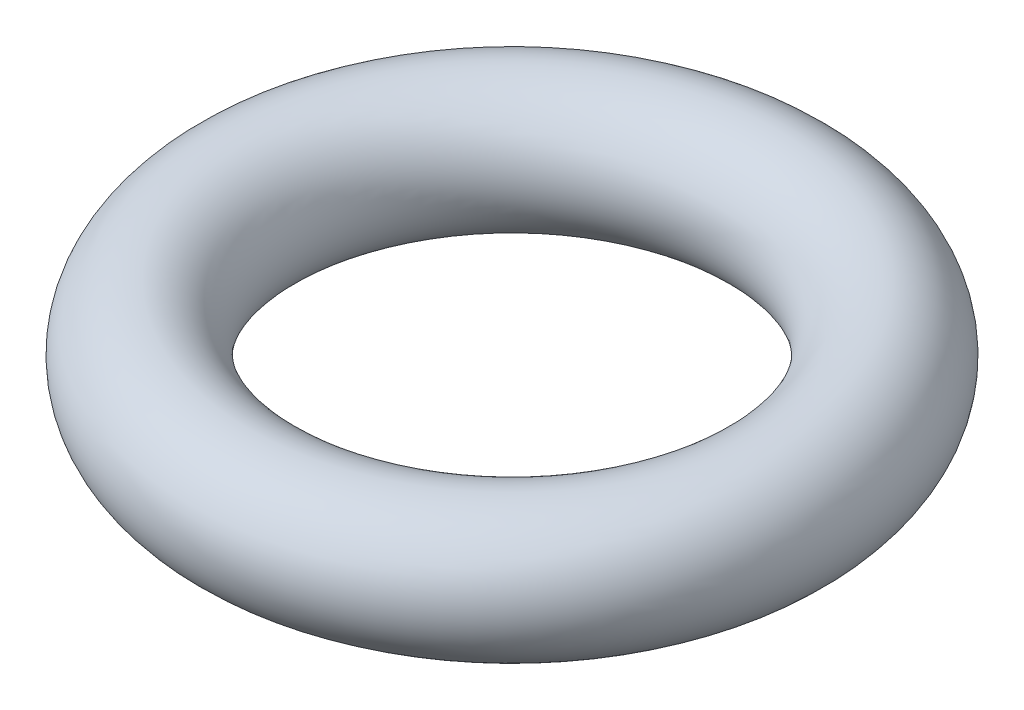
ISO-10303-21;
HEADER;
FILE_DESCRIPTION(('STEP AP214'),'2;1');
FILE_NAME('part.step','',(''),(''),'','','');
FILE_SCHEMA(('AUTOMOTIVE_DESIGN { 1 0 10303 214 1 1 1 1 }'));
ENDSEC;
DATA;
#1=APPLICATION_CONTEXT('core data for automotive mechanical design processes');
#2=APPLICATION_PROTOCOL_DEFINITION('international standard','automotive_design',2000,#1);
#3=PRODUCT_CONTEXT('',#1,'mechanical');
#4=PRODUCT('Part','Part','',(#3));
#5=PRODUCT_RELATED_PRODUCT_CATEGORY('part','',(#4));
#6=PRODUCT_DEFINITION_FORMATION('','',#4);
#7=PRODUCT_DEFINITION_CONTEXT('part definition',#1,'design');
#8=PRODUCT_DEFINITION('design','',#6,#7);
#9=PRODUCT_DEFINITION_SHAPE('','',#8);
#10=(LENGTH_UNIT() NAMED_UNIT(*) SI_UNIT(.MILLI.,.METRE.));
#11=(NAMED_UNIT(*) PLANE_ANGLE_UNIT() SI_UNIT($,.RADIAN.));
#12=(NAMED_UNIT(*) SI_UNIT($,.STERADIAN.) SOLID_ANGLE_UNIT());
#13=UNCERTAINTY_MEASURE_WITH_UNIT(LENGTH_MEASURE(1.E-05),#10,'distance_accuracy_value','');
#14=(GEOMETRIC_REPRESENTATION_CONTEXT(3) GLOBAL_UNCERTAINTY_ASSIGNED_CONTEXT((#13)) GLOBAL_UNIT_ASSIGNED_CONTEXT((#10,
#11,#12)) REPRESENTATION_CONTEXT('',''));
#15=CARTESIAN_POINT('',(0.,0.,0.));
#16=DIRECTION('',(0.,0.,1.));
#17=DIRECTION('',(1.,0.,0.));
#18=AXIS2_PLACEMENT_3D('',#15,#16,#17);
#19=CARTESIAN_POINT('',(0.,0.,0.));
#20=DIRECTION('',(0.,-1.,0.));
#21=DIRECTION('',(0.,0.,-1.));
#22=AXIS2_PLACEMENT_3D('',#19,#20,#21);
#23=TOROIDAL_SURFACE('',#22,3.,0.75);
#24=CARTESIAN_POINT('',(0.,0.,-3.75));
#25=VERTEX_POINT('',#24);
#26=VERTEX_LOOP('',#25);
#27=FACE_BOUND('',#26,.T.);
#28=ADVANCED_FACE('F28',(#27),#23,.T.);
#29=CLOSED_SHELL('',(#28));
#30=MANIFOLD_SOLID_BREP('B2',#29);
#31=ADVANCED_BREP_SHAPE_REPRESENTATION('',(#18,#30),#14);
#32=SHAPE_DEFINITION_REPRESENTATION(#9,#31);
ENDSEC;
END-ISO-10303-21;
